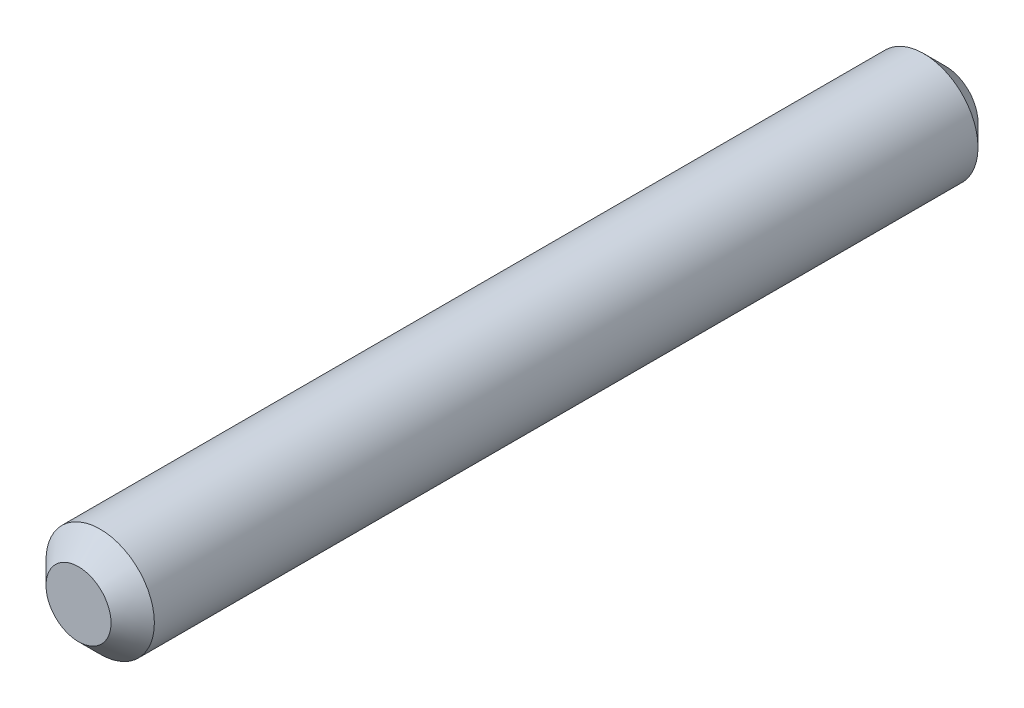
ISO-10303-21;
HEADER;
FILE_DESCRIPTION(('STEP AP214'),'2;1');
FILE_NAME('part.step','',(''),(''),'','','');
FILE_SCHEMA(('AUTOMOTIVE_DESIGN { 1 0 10303 214 1 1 1 1 }'));
ENDSEC;
DATA;
#1=APPLICATION_CONTEXT('core data for automotive mechanical design processes');
#2=APPLICATION_PROTOCOL_DEFINITION('international standard','automotive_design',2000,#1);
#3=PRODUCT_CONTEXT('',#1,'mechanical');
#4=PRODUCT('Part','Part','',(#3));
#5=PRODUCT_RELATED_PRODUCT_CATEGORY('part','',(#4));
#6=PRODUCT_DEFINITION_FORMATION('','',#4);
#7=PRODUCT_DEFINITION_CONTEXT('part definition',#1,'design');
#8=PRODUCT_DEFINITION('design','',#6,#7);
#9=PRODUCT_DEFINITION_SHAPE('','',#8);
#10=(LENGTH_UNIT() NAMED_UNIT(*) SI_UNIT(.MILLI.,.METRE.));
#11=(NAMED_UNIT(*) PLANE_ANGLE_UNIT() SI_UNIT($,.RADIAN.));
#12=(NAMED_UNIT(*) SI_UNIT($,.STERADIAN.) SOLID_ANGLE_UNIT());
#13=UNCERTAINTY_MEASURE_WITH_UNIT(LENGTH_MEASURE(1.E-05),#10,'distance_accuracy_value','');
#14=(GEOMETRIC_REPRESENTATION_CONTEXT(3) GLOBAL_UNCERTAINTY_ASSIGNED_CONTEXT((#13)) GLOBAL_UNIT_ASSIGNED_CONTEXT((#10,
#11,#12)) REPRESENTATION_CONTEXT('',''));
#15=CARTESIAN_POINT('',(0.,0.,0.));
#16=DIRECTION('',(0.,0.,1.));
#17=DIRECTION('',(1.,0.,0.));
#18=AXIS2_PLACEMENT_3D('',#15,#16,#17);
#19=CARTESIAN_POINT('',(0.,0.,40.));
#20=DIRECTION('',(0.,0.,-1.));
#21=DIRECTION('',(-1.,0.,0.));
#22=AXIS2_PLACEMENT_3D('',#19,#20,#21);
#23=CYLINDRICAL_SURFACE('',#22,2.5);
#24=CARTESIAN_POINT('',(0.,0.,1.00000000000001));
#25=DIRECTION('',(0.,0.,1.));
#26=DIRECTION('',(1.,0.,0.));
#27=AXIS2_PLACEMENT_3D('',#24,#25,#26);
#28=CIRCLE('',#27,2.5);
#29=CARTESIAN_POINT('',(2.5,0.,1.00000000000001));
#30=VERTEX_POINT('',#29);
#31=EDGE_CURVE('E42',#30,#30,#28,.T.);
#32=ORIENTED_EDGE('',*,*,#31,.T.);
#33=EDGE_LOOP('',(#32));
#34=FACE_BOUND('',#33,.T.);
#35=CARTESIAN_POINT('',(0.,0.,39.));
#36=DIRECTION('',(0.,0.,1.));
#37=DIRECTION('',(1.,0.,0.));
#38=AXIS2_PLACEMENT_3D('',#35,#36,#37);
#39=CIRCLE('',#38,2.5);
#40=CARTESIAN_POINT('',(2.5,0.,39.));
#41=VERTEX_POINT('',#40);
#42=EDGE_CURVE('E46',#41,#41,#39,.F.);
#43=ORIENTED_EDGE('',*,*,#42,.T.);
#44=EDGE_LOOP('',(#43));
#45=FACE_BOUND('',#44,.T.);
#46=ADVANCED_FACE('F31',(#34,#45),#23,.T.);
#47=CARTESIAN_POINT('',(0.,0.,40.));
#48=DIRECTION('',(0.,0.,1.));
#49=DIRECTION('',(1.,0.,0.));
#50=AXIS2_PLACEMENT_3D('',#47,#48,#49);
#51=PLANE('',#50);
#52=CARTESIAN_POINT('',(0.,0.,40.));
#53=DIRECTION('',(0.,0.,1.));
#54=DIRECTION('',(1.,0.,0.));
#55=AXIS2_PLACEMENT_3D('',#52,#53,#54);
#56=CIRCLE('',#55,1.49999999999999);
#57=CARTESIAN_POINT('',(1.49999999999999,0.,40.));
#58=VERTEX_POINT('',#57);
#59=EDGE_CURVE('E10',#58,#58,#56,.T.);
#60=ORIENTED_EDGE('',*,*,#59,.T.);
#61=EDGE_LOOP('',(#60));
#62=FACE_BOUND('',#61,.T.);
#63=ADVANCED_FACE('F62',(#62),#51,.T.);
#64=CARTESIAN_POINT('',(0.,0.,0.));
#65=DIRECTION('',(0.,0.,1.));
#66=DIRECTION('',(1.,0.,0.));
#67=AXIS2_PLACEMENT_3D('',#64,#65,#66);
#68=PLANE('',#67);
#69=CARTESIAN_POINT('',(0.,0.,0.));
#70=DIRECTION('',(0.,0.,1.));
#71=DIRECTION('',(1.,0.,0.));
#72=AXIS2_PLACEMENT_3D('',#69,#70,#71);
#73=CIRCLE('',#72,1.49999999999999);
#74=CARTESIAN_POINT('',(1.49999999999999,0.,0.));
#75=VERTEX_POINT('',#74);
#76=EDGE_CURVE('E38',#75,#75,#73,.F.);
#77=ORIENTED_EDGE('',*,*,#76,.T.);
#78=EDGE_LOOP('',(#77));
#79=FACE_BOUND('',#78,.T.);
#80=ADVANCED_FACE('F59',(#79),#68,.F.);
#81=CARTESIAN_POINT('',(0.,0.,1.00000000000001));
#82=DIRECTION('',(0.,0.,1.));
#83=DIRECTION('',(1.,0.,0.));
#84=AXIS2_PLACEMENT_3D('',#81,#82,#83);
#85=CONICAL_SURFACE('',#84,2.5,0.785398163397449);
#86=ORIENTED_EDGE('',*,*,#76,.F.);
#87=EDGE_LOOP('',(#86));
#88=FACE_BOUND('',#87,.T.);
#89=ORIENTED_EDGE('',*,*,#31,.F.);
#90=EDGE_LOOP('',(#89));
#91=FACE_BOUND('',#90,.T.);
#92=ADVANCED_FACE('F55',(#88,#91),#85,.T.);
#93=CARTESIAN_POINT('',(0.,0.,40.));
#94=DIRECTION('',(0.,0.,-1.));
#95=DIRECTION('',(-1.,0.,0.));
#96=AXIS2_PLACEMENT_3D('',#93,#94,#95);
#97=CONICAL_SURFACE('',#96,1.49999999999999,0.785398163397446);
#98=ORIENTED_EDGE('',*,*,#42,.F.);
#99=EDGE_LOOP('',(#98));
#100=FACE_BOUND('',#99,.T.);
#101=ORIENTED_EDGE('',*,*,#59,.F.);
#102=EDGE_LOOP('',(#101));
#103=FACE_BOUND('',#102,.T.);
#104=ADVANCED_FACE('F33',(#100,#103),#97,.T.);
#105=CLOSED_SHELL('',(#46,#63,#80,#92,#104));
#106=MANIFOLD_SOLID_BREP('B2',#105);
#107=ADVANCED_BREP_SHAPE_REPRESENTATION('',(#18,#106),#14);
#108=SHAPE_DEFINITION_REPRESENTATION(#9,#107);
ENDSEC;
END-ISO-10303-21;
